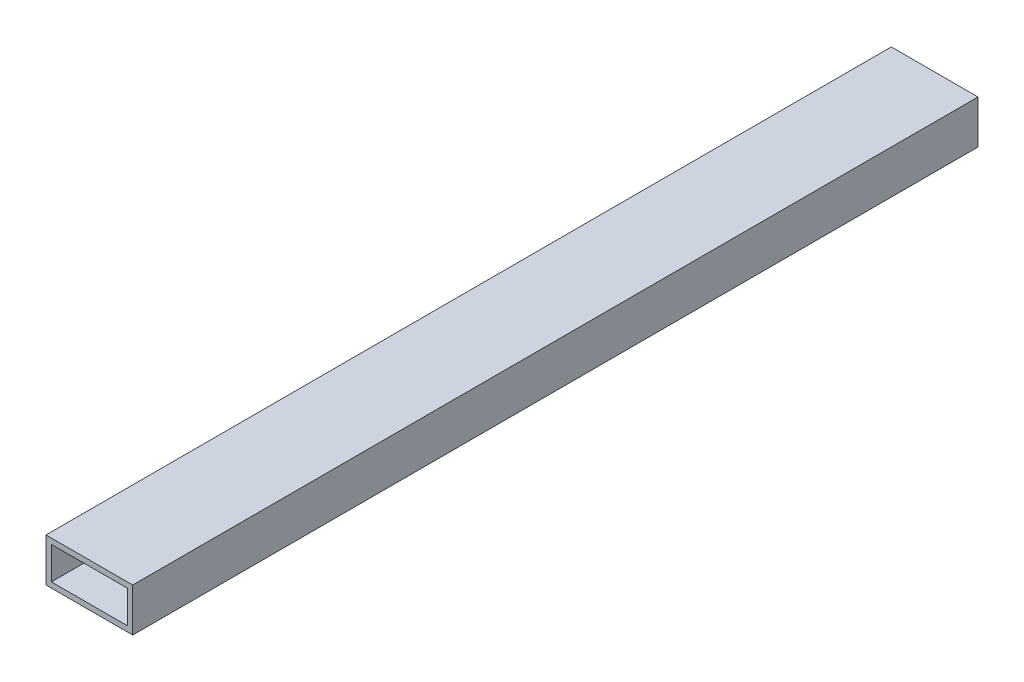
ISO-10303-21;
HEADER;
FILE_DESCRIPTION(('STEP AP214'),'2;1');
FILE_NAME('part.step','',(''),(''),'','','');
FILE_SCHEMA(('AUTOMOTIVE_DESIGN { 1 0 10303 214 1 1 1 1 }'));
ENDSEC;
DATA;
#1=APPLICATION_CONTEXT('core data for automotive mechanical design processes');
#2=APPLICATION_PROTOCOL_DEFINITION('international standard','automotive_design',2000,#1);
#3=PRODUCT_CONTEXT('',#1,'mechanical');
#4=PRODUCT('Part','Part','',(#3));
#5=PRODUCT_RELATED_PRODUCT_CATEGORY('part','',(#4));
#6=PRODUCT_DEFINITION_FORMATION('','',#4);
#7=PRODUCT_DEFINITION_CONTEXT('part definition',#1,'design');
#8=PRODUCT_DEFINITION('design','',#6,#7);
#9=PRODUCT_DEFINITION_SHAPE('','',#8);
#10=(LENGTH_UNIT() NAMED_UNIT(*) SI_UNIT(.MILLI.,.METRE.));
#11=(NAMED_UNIT(*) PLANE_ANGLE_UNIT() SI_UNIT($,.RADIAN.));
#12=(NAMED_UNIT(*) SI_UNIT($,.STERADIAN.) SOLID_ANGLE_UNIT());
#13=UNCERTAINTY_MEASURE_WITH_UNIT(LENGTH_MEASURE(1.E-05),#10,'distance_accuracy_value','');
#14=(GEOMETRIC_REPRESENTATION_CONTEXT(3) GLOBAL_UNCERTAINTY_ASSIGNED_CONTEXT((#13)) GLOBAL_UNIT_ASSIGNED_CONTEXT((#10,
#11,#12)) REPRESENTATION_CONTEXT('',''));
#15=CARTESIAN_POINT('',(0.,0.,0.));
#16=DIRECTION('',(0.,0.,1.));
#17=DIRECTION('',(1.,0.,0.));
#18=AXIS2_PLACEMENT_3D('',#15,#16,#17);
#19=CARTESIAN_POINT('',(0.,0.,495.3));
#20=DIRECTION('',(0.,0.,-1.));
#21=DIRECTION('',(-1.,0.,0.));
#22=AXIS2_PLACEMENT_3D('',#19,#20,#21);
#23=PLANE('',#22);
#24=DIRECTION('',(0.,-1.,0.));
#25=VECTOR('',#24,1.);
#26=CARTESIAN_POINT('',(0.,0.,495.3));
#27=LINE('',#26,#25);
#28=CARTESIAN_POINT('',(0.,25.4,495.3));
#29=VERTEX_POINT('',#28);
#30=CARTESIAN_POINT('',(0.,0.,495.3));
#31=VERTEX_POINT('',#30);
#32=EDGE_CURVE('E134',#29,#31,#27,.T.);
#33=ORIENTED_EDGE('',*,*,#32,.T.);
#34=DIRECTION('',(1.,0.,0.));
#35=VECTOR('',#34,1.);
#36=CARTESIAN_POINT('',(0.,0.,495.3));
#37=LINE('',#36,#35);
#38=CARTESIAN_POINT('',(50.8,0.,495.3));
#39=VERTEX_POINT('',#38);
#40=EDGE_CURVE('E137',#31,#39,#37,.T.);
#41=ORIENTED_EDGE('',*,*,#40,.T.);
#42=DIRECTION('',(0.,1.,0.));
#43=VECTOR('',#42,1.);
#44=CARTESIAN_POINT('',(50.8,0.,495.3));
#45=LINE('',#44,#43);
#46=CARTESIAN_POINT('',(50.8,25.4,495.3));
#47=VERTEX_POINT('',#46);
#48=EDGE_CURVE('E140',#39,#47,#45,.T.);
#49=ORIENTED_EDGE('',*,*,#48,.T.);
#50=DIRECTION('',(-1.,0.,0.));
#51=VECTOR('',#50,1.);
#52=CARTESIAN_POINT('',(0.,25.4,495.3));
#53=LINE('',#52,#51);
#54=EDGE_CURVE('E142',#47,#29,#53,.T.);
#55=ORIENTED_EDGE('',*,*,#54,.T.);
#56=EDGE_LOOP('',(#33,#41,#49,#55));
#57=FACE_BOUND('',#56,.T.);
#58=DIRECTION('',(0.,-1.,0.));
#59=VECTOR('',#58,1.);
#60=CARTESIAN_POINT('',(3.175,3.175,495.3));
#61=LINE('',#60,#59);
#62=CARTESIAN_POINT('',(3.175,22.225,495.3));
#63=VERTEX_POINT('',#62);
#64=CARTESIAN_POINT('',(3.175,3.175,495.3));
#65=VERTEX_POINT('',#64);
#66=EDGE_CURVE('E98',#63,#65,#61,.T.);
#67=ORIENTED_EDGE('',*,*,#66,.F.);
#68=DIRECTION('',(-1.,0.,0.));
#69=VECTOR('',#68,1.);
#70=CARTESIAN_POINT('',(3.175,22.225,495.3));
#71=LINE('',#70,#69);
#72=CARTESIAN_POINT('',(47.625,22.225,495.3));
#73=VERTEX_POINT('',#72);
#74=EDGE_CURVE('E120',#73,#63,#71,.T.);
#75=ORIENTED_EDGE('',*,*,#74,.F.);
#76=DIRECTION('',(0.,1.,0.));
#77=VECTOR('',#76,1.);
#78=CARTESIAN_POINT('',(47.625,3.175,495.3));
#79=LINE('',#78,#77);
#80=CARTESIAN_POINT('',(47.625,3.175,495.3));
#81=VERTEX_POINT('',#80);
#82=EDGE_CURVE('E118',#81,#73,#79,.T.);
#83=ORIENTED_EDGE('',*,*,#82,.F.);
#84=DIRECTION('',(1.,0.,0.));
#85=VECTOR('',#84,1.);
#86=CARTESIAN_POINT('',(3.175,3.175,495.3));
#87=LINE('',#86,#85);
#88=EDGE_CURVE('E106',#65,#81,#87,.T.);
#89=ORIENTED_EDGE('',*,*,#88,.F.);
#90=EDGE_LOOP('',(#67,#75,#83,#89));
#91=FACE_BOUND('',#90,.T.);
#92=ADVANCED_FACE('F33',(#57,#91),#23,.F.);
#93=CARTESIAN_POINT('',(0.,0.,0.));
#94=DIRECTION('',(0.,0.,-1.));
#95=DIRECTION('',(-1.,0.,0.));
#96=AXIS2_PLACEMENT_3D('',#93,#94,#95);
#97=PLANE('',#96);
#98=DIRECTION('',(0.,-1.,0.));
#99=VECTOR('',#98,1.);
#100=CARTESIAN_POINT('',(0.,0.,0.));
#101=LINE('',#100,#99);
#102=CARTESIAN_POINT('',(0.,25.4,0.));
#103=VERTEX_POINT('',#102);
#104=CARTESIAN_POINT('',(0.,0.,0.));
#105=VERTEX_POINT('',#104);
#106=EDGE_CURVE('E114',#103,#105,#101,.T.);
#107=ORIENTED_EDGE('',*,*,#106,.F.);
#108=DIRECTION('',(-1.,0.,0.));
#109=VECTOR('',#108,1.);
#110=CARTESIAN_POINT('',(0.,25.4,0.));
#111=LINE('',#110,#109);
#112=CARTESIAN_POINT('',(50.8,25.4,0.));
#113=VERTEX_POINT('',#112);
#114=EDGE_CURVE('E138',#113,#103,#111,.T.);
#115=ORIENTED_EDGE('',*,*,#114,.F.);
#116=DIRECTION('',(0.,1.,0.));
#117=VECTOR('',#116,1.);
#118=CARTESIAN_POINT('',(50.8,0.,0.));
#119=LINE('',#118,#117);
#120=CARTESIAN_POINT('',(50.8,0.,0.));
#121=VERTEX_POINT('',#120);
#122=EDGE_CURVE('E149',#121,#113,#119,.T.);
#123=ORIENTED_EDGE('',*,*,#122,.F.);
#124=DIRECTION('',(1.,0.,0.));
#125=VECTOR('',#124,1.);
#126=CARTESIAN_POINT('',(0.,0.,0.));
#127=LINE('',#126,#125);
#128=EDGE_CURVE('E147',#105,#121,#127,.T.);
#129=ORIENTED_EDGE('',*,*,#128,.F.);
#130=EDGE_LOOP('',(#107,#115,#123,#129));
#131=FACE_BOUND('',#130,.T.);
#132=DIRECTION('',(-1.,0.,0.));
#133=VECTOR('',#132,1.);
#134=CARTESIAN_POINT('',(3.175,22.225,0.));
#135=LINE('',#134,#133);
#136=CARTESIAN_POINT('',(47.625,22.225,0.));
#137=VERTEX_POINT('',#136);
#138=CARTESIAN_POINT('',(3.175,22.225,0.));
#139=VERTEX_POINT('',#138);
#140=EDGE_CURVE('E107',#137,#139,#135,.T.);
#141=ORIENTED_EDGE('',*,*,#140,.T.);
#142=DIRECTION('',(0.,-1.,0.));
#143=VECTOR('',#142,1.);
#144=CARTESIAN_POINT('',(3.175,3.175,0.));
#145=LINE('',#144,#143);
#146=CARTESIAN_POINT('',(3.175,3.175,0.));
#147=VERTEX_POINT('',#146);
#148=EDGE_CURVE('E56',#139,#147,#145,.T.);
#149=ORIENTED_EDGE('',*,*,#148,.T.);
#150=DIRECTION('',(1.,0.,0.));
#151=VECTOR('',#150,1.);
#152=CARTESIAN_POINT('',(3.175,3.175,0.));
#153=LINE('',#152,#151);
#154=CARTESIAN_POINT('',(47.625,3.175,0.));
#155=VERTEX_POINT('',#154);
#156=EDGE_CURVE('E113',#147,#155,#153,.T.);
#157=ORIENTED_EDGE('',*,*,#156,.T.);
#158=DIRECTION('',(0.,1.,0.));
#159=VECTOR('',#158,1.);
#160=CARTESIAN_POINT('',(47.625,3.175,0.));
#161=LINE('',#160,#159);
#162=EDGE_CURVE('E126',#155,#137,#161,.T.);
#163=ORIENTED_EDGE('',*,*,#162,.T.);
#164=EDGE_LOOP('',(#141,#149,#157,#163));
#165=FACE_BOUND('',#164,.T.);
#166=ADVANCED_FACE('F167',(#131,#165),#97,.T.);
#167=CARTESIAN_POINT('',(0.,0.,495.3));
#168=DIRECTION('',(1.,0.,0.));
#169=DIRECTION('',(0.,0.,-1.));
#170=AXIS2_PLACEMENT_3D('',#167,#168,#169);
#171=PLANE('',#170);
#172=ORIENTED_EDGE('',*,*,#106,.T.);
#173=DIRECTION('',(0.,0.,-1.));
#174=VECTOR('',#173,1.);
#175=CARTESIAN_POINT('',(0.,0.,495.3));
#176=LINE('',#175,#174);
#177=EDGE_CURVE('E11',#31,#105,#176,.T.);
#178=ORIENTED_EDGE('',*,*,#177,.F.);
#179=ORIENTED_EDGE('',*,*,#32,.F.);
#180=DIRECTION('',(0.,0.,-1.));
#181=VECTOR('',#180,1.);
#182=CARTESIAN_POINT('',(0.,25.4,495.3));
#183=LINE('',#182,#181);
#184=EDGE_CURVE('E144',#29,#103,#183,.T.);
#185=ORIENTED_EDGE('',*,*,#184,.T.);
#186=EDGE_LOOP('',(#172,#178,#179,#185));
#187=FACE_BOUND('',#186,.T.);
#188=ADVANCED_FACE('F35',(#187),#171,.F.);
#189=CARTESIAN_POINT('',(0.,0.,495.3));
#190=DIRECTION('',(0.,1.,0.));
#191=DIRECTION('',(0.,0.,1.));
#192=AXIS2_PLACEMENT_3D('',#189,#190,#191);
#193=PLANE('',#192);
#194=ORIENTED_EDGE('',*,*,#128,.T.);
#195=DIRECTION('',(0.,0.,-1.));
#196=VECTOR('',#195,1.);
#197=CARTESIAN_POINT('',(50.8,0.,495.3));
#198=LINE('',#197,#196);
#199=EDGE_CURVE('E41',#39,#121,#198,.T.);
#200=ORIENTED_EDGE('',*,*,#199,.F.);
#201=ORIENTED_EDGE('',*,*,#40,.F.);
#202=ORIENTED_EDGE('',*,*,#177,.T.);
#203=EDGE_LOOP('',(#194,#200,#201,#202));
#204=FACE_BOUND('',#203,.T.);
#205=ADVANCED_FACE('F177',(#204),#193,.F.);
#206=CARTESIAN_POINT('',(50.8,0.,495.3));
#207=DIRECTION('',(-1.,0.,0.));
#208=DIRECTION('',(0.,0.,1.));
#209=AXIS2_PLACEMENT_3D('',#206,#207,#208);
#210=PLANE('',#209);
#211=ORIENTED_EDGE('',*,*,#122,.T.);
#212=DIRECTION('',(0.,0.,-1.));
#213=VECTOR('',#212,1.);
#214=CARTESIAN_POINT('',(50.8,25.4,495.3));
#215=LINE('',#214,#213);
#216=EDGE_CURVE('E154',#47,#113,#215,.T.);
#217=ORIENTED_EDGE('',*,*,#216,.F.);
#218=ORIENTED_EDGE('',*,*,#48,.F.);
#219=ORIENTED_EDGE('',*,*,#199,.T.);
#220=EDGE_LOOP('',(#211,#217,#218,#219));
#221=FACE_BOUND('',#220,.T.);
#222=ADVANCED_FACE('F161',(#221),#210,.F.);
#223=CARTESIAN_POINT('',(0.,25.4,495.3));
#224=DIRECTION('',(0.,-1.,0.));
#225=DIRECTION('',(0.,0.,-1.));
#226=AXIS2_PLACEMENT_3D('',#223,#224,#225);
#227=PLANE('',#226);
#228=ORIENTED_EDGE('',*,*,#114,.T.);
#229=ORIENTED_EDGE('',*,*,#184,.F.);
#230=ORIENTED_EDGE('',*,*,#54,.F.);
#231=ORIENTED_EDGE('',*,*,#216,.T.);
#232=EDGE_LOOP('',(#228,#229,#230,#231));
#233=FACE_BOUND('',#232,.T.);
#234=ADVANCED_FACE('F171',(#233),#227,.F.);
#235=CARTESIAN_POINT('',(3.175,3.175,495.3));
#236=DIRECTION('',(1.,0.,0.));
#237=DIRECTION('',(0.,0.,-1.));
#238=AXIS2_PLACEMENT_3D('',#235,#236,#237);
#239=PLANE('',#238);
#240=ORIENTED_EDGE('',*,*,#148,.F.);
#241=DIRECTION('',(0.,0.,-1.));
#242=VECTOR('',#241,1.);
#243=CARTESIAN_POINT('',(3.175,22.225,495.3));
#244=LINE('',#243,#242);
#245=EDGE_CURVE('E102',#63,#139,#244,.T.);
#246=ORIENTED_EDGE('',*,*,#245,.F.);
#247=ORIENTED_EDGE('',*,*,#66,.T.);
#248=DIRECTION('',(0.,0.,-1.));
#249=VECTOR('',#248,1.);
#250=CARTESIAN_POINT('',(3.175,3.175,495.3));
#251=LINE('',#250,#249);
#252=EDGE_CURVE('E101',#65,#147,#251,.T.);
#253=ORIENTED_EDGE('',*,*,#252,.T.);
#254=EDGE_LOOP('',(#240,#246,#247,#253));
#255=FACE_BOUND('',#254,.T.);
#256=ADVANCED_FACE('F100',(#255),#239,.T.);
#257=CARTESIAN_POINT('',(3.175,3.175,495.3));
#258=DIRECTION('',(0.,1.,0.));
#259=DIRECTION('',(0.,0.,1.));
#260=AXIS2_PLACEMENT_3D('',#257,#258,#259);
#261=PLANE('',#260);
#262=ORIENTED_EDGE('',*,*,#156,.F.);
#263=ORIENTED_EDGE('',*,*,#252,.F.);
#264=ORIENTED_EDGE('',*,*,#88,.T.);
#265=DIRECTION('',(0.,0.,-1.));
#266=VECTOR('',#265,1.);
#267=CARTESIAN_POINT('',(47.625,3.175,495.3));
#268=LINE('',#267,#266);
#269=EDGE_CURVE('E115',#81,#155,#268,.T.);
#270=ORIENTED_EDGE('',*,*,#269,.T.);
#271=EDGE_LOOP('',(#262,#263,#264,#270));
#272=FACE_BOUND('',#271,.T.);
#273=ADVANCED_FACE('F110',(#272),#261,.T.);
#274=CARTESIAN_POINT('',(47.625,3.175,495.3));
#275=DIRECTION('',(-1.,0.,0.));
#276=DIRECTION('',(0.,0.,1.));
#277=AXIS2_PLACEMENT_3D('',#274,#275,#276);
#278=PLANE('',#277);
#279=ORIENTED_EDGE('',*,*,#162,.F.);
#280=ORIENTED_EDGE('',*,*,#269,.F.);
#281=ORIENTED_EDGE('',*,*,#82,.T.);
#282=DIRECTION('',(0.,0.,-1.));
#283=VECTOR('',#282,1.);
#284=CARTESIAN_POINT('',(47.625,22.225,495.3));
#285=LINE('',#284,#283);
#286=EDGE_CURVE('E48',#73,#137,#285,.T.);
#287=ORIENTED_EDGE('',*,*,#286,.T.);
#288=EDGE_LOOP('',(#279,#280,#281,#287));
#289=FACE_BOUND('',#288,.T.);
#290=ADVANCED_FACE('F200',(#289),#278,.T.);
#291=CARTESIAN_POINT('',(3.175,22.225,495.3));
#292=DIRECTION('',(0.,-1.,0.));
#293=DIRECTION('',(1.,0.,0.));
#294=AXIS2_PLACEMENT_3D('',#291,#292,#293);
#295=PLANE('',#294);
#296=ORIENTED_EDGE('',*,*,#140,.F.);
#297=ORIENTED_EDGE('',*,*,#286,.F.);
#298=ORIENTED_EDGE('',*,*,#74,.T.);
#299=ORIENTED_EDGE('',*,*,#245,.T.);
#300=EDGE_LOOP('',(#296,#297,#298,#299));
#301=FACE_BOUND('',#300,.T.);
#302=ADVANCED_FACE('F204',(#301),#295,.T.);
#303=CLOSED_SHELL('',(#92,#166,#188,#205,#222,#234,#256,#273,#290,#302));
#304=MANIFOLD_SOLID_BREP('B2',#303);
#305=ADVANCED_BREP_SHAPE_REPRESENTATION('',(#18,#304),#14);
#306=SHAPE_DEFINITION_REPRESENTATION(#9,#305);
ENDSEC;
END-ISO-10303-21;
